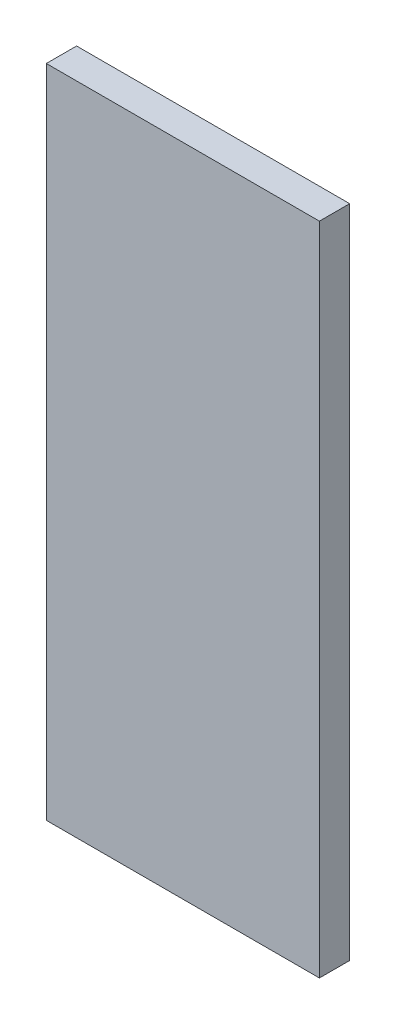
ISO-10303-21;
HEADER;
FILE_DESCRIPTION(('STEP AP214'),'2;1');
FILE_NAME('part.step','',(''),(''),'','','');
FILE_SCHEMA(('AUTOMOTIVE_DESIGN { 1 0 10303 214 1 1 1 1 }'));
ENDSEC;
DATA;
#1=APPLICATION_CONTEXT('core data for automotive mechanical design processes');
#2=APPLICATION_PROTOCOL_DEFINITION('international standard','automotive_design',2000,#1);
#3=PRODUCT_CONTEXT('',#1,'mechanical');
#4=PRODUCT('Part','Part','',(#3));
#5=PRODUCT_RELATED_PRODUCT_CATEGORY('part','',(#4));
#6=PRODUCT_DEFINITION_FORMATION('','',#4);
#7=PRODUCT_DEFINITION_CONTEXT('part definition',#1,'design');
#8=PRODUCT_DEFINITION('design','',#6,#7);
#9=PRODUCT_DEFINITION_SHAPE('','',#8);
#10=(LENGTH_UNIT() NAMED_UNIT(*) SI_UNIT(.MILLI.,.METRE.));
#11=(NAMED_UNIT(*) PLANE_ANGLE_UNIT() SI_UNIT($,.RADIAN.));
#12=(NAMED_UNIT(*) SI_UNIT($,.STERADIAN.) SOLID_ANGLE_UNIT());
#13=UNCERTAINTY_MEASURE_WITH_UNIT(LENGTH_MEASURE(1.E-05),#10,'distance_accuracy_value','');
#14=(GEOMETRIC_REPRESENTATION_CONTEXT(3) GLOBAL_UNCERTAINTY_ASSIGNED_CONTEXT((#13)) GLOBAL_UNIT_ASSIGNED_CONTEXT((#10,
#11,#12)) REPRESENTATION_CONTEXT('',''));
#15=CARTESIAN_POINT('',(0.,0.,0.));
#16=DIRECTION('',(0.,0.,1.));
#17=DIRECTION('',(1.,0.,0.));
#18=AXIS2_PLACEMENT_3D('',#15,#16,#17);
#19=CARTESIAN_POINT('',(-267.500000051,825.,76.2));
#20=DIRECTION('',(0.,-1.,0.));
#21=DIRECTION('',(0.,0.,-1.));
#22=AXIS2_PLACEMENT_3D('',#19,#20,#21);
#23=PLANE('',#22);
#24=DIRECTION('',(-1.,0.,0.));
#25=VECTOR('',#24,1.);
#26=CARTESIAN_POINT('',(-267.500000051,825.,0.));
#27=LINE('',#26,#25);
#28=CARTESIAN_POINT('',(343.700000051,825.,0.));
#29=VERTEX_POINT('',#28);
#30=CARTESIAN_POINT('',(-343.700000051,825.,0.));
#31=VERTEX_POINT('',#30);
#32=EDGE_CURVE('E65',#29,#31,#27,.T.);
#33=ORIENTED_EDGE('',*,*,#32,.T.);
#34=DIRECTION('',(0.,0.,-1.));
#35=VECTOR('',#34,1.);
#36=CARTESIAN_POINT('',(-343.700000051,825.,0.));
#37=LINE('',#36,#35);
#38=CARTESIAN_POINT('',(-343.700000051,825.,76.1999999999998));
#39=VERTEX_POINT('',#38);
#40=EDGE_CURVE('E101',#39,#31,#37,.T.);
#41=ORIENTED_EDGE('',*,*,#40,.F.);
#42=DIRECTION('',(-1.,0.,0.));
#43=VECTOR('',#42,1.);
#44=CARTESIAN_POINT('',(-267.500000051,825.,76.2));
#45=LINE('',#44,#43);
#46=CARTESIAN_POINT('',(343.700000051,825.,76.2));
#47=VERTEX_POINT('',#46);
#48=EDGE_CURVE('E50',#47,#39,#45,.T.);
#49=ORIENTED_EDGE('',*,*,#48,.F.);
#50=DIRECTION('',(0.,0.,1.));
#51=VECTOR('',#50,1.);
#52=CARTESIAN_POINT('',(343.700000051,825.,76.2));
#53=LINE('',#52,#51);
#54=EDGE_CURVE('E118',#29,#47,#53,.T.);
#55=ORIENTED_EDGE('',*,*,#54,.F.);
#56=EDGE_LOOP('',(#33,#41,#49,#55));
#57=FACE_BOUND('',#56,.T.);
#58=ADVANCED_FACE('F41',(#57),#23,.F.);
#59=CARTESIAN_POINT('',(-267.500000051,-825.,76.2));
#60=DIRECTION('',(0.,1.,0.));
#61=DIRECTION('',(0.,0.,1.));
#62=AXIS2_PLACEMENT_3D('',#59,#60,#61);
#63=PLANE('',#62);
#64=DIRECTION('',(1.,0.,0.));
#65=VECTOR('',#64,1.);
#66=CARTESIAN_POINT('',(-267.500000051,-825.,0.));
#67=LINE('',#66,#65);
#68=CARTESIAN_POINT('',(-343.700000051,-825.,0.));
#69=VERTEX_POINT('',#68);
#70=CARTESIAN_POINT('',(343.700000051,-825.,0.));
#71=VERTEX_POINT('',#70);
#72=EDGE_CURVE('E44',#69,#71,#67,.T.);
#73=ORIENTED_EDGE('',*,*,#72,.T.);
#74=DIRECTION('',(0.,0.,-1.));
#75=VECTOR('',#74,1.);
#76=CARTESIAN_POINT('',(343.700000051,-825.,76.1999999999998));
#77=LINE('',#76,#75);
#78=CARTESIAN_POINT('',(343.700000051,-825.,76.1999999999998));
#79=VERTEX_POINT('',#78);
#80=EDGE_CURVE('E113',#79,#71,#77,.T.);
#81=ORIENTED_EDGE('',*,*,#80,.F.);
#82=DIRECTION('',(1.,0.,0.));
#83=VECTOR('',#82,1.);
#84=CARTESIAN_POINT('',(-267.500000051,-825.,76.2));
#85=LINE('',#84,#83);
#86=CARTESIAN_POINT('',(-343.700000051,-825.,76.2));
#87=VERTEX_POINT('',#86);
#88=EDGE_CURVE('E11',#87,#79,#85,.T.);
#89=ORIENTED_EDGE('',*,*,#88,.F.);
#90=DIRECTION('',(0.,0.,1.));
#91=VECTOR('',#90,1.);
#92=CARTESIAN_POINT('',(-343.700000051,-825.,0.));
#93=LINE('',#92,#91);
#94=EDGE_CURVE('E91',#69,#87,#93,.T.);
#95=ORIENTED_EDGE('',*,*,#94,.F.);
#96=EDGE_LOOP('',(#73,#81,#89,#95));
#97=FACE_BOUND('',#96,.T.);
#98=ADVANCED_FACE('F92',(#97),#63,.F.);
#99=CARTESIAN_POINT('',(0.,0.,76.2));
#100=DIRECTION('',(0.,0.,-1.));
#101=DIRECTION('',(-1.,0.,0.));
#102=AXIS2_PLACEMENT_3D('',#99,#100,#101);
#103=PLANE('',#102);
#104=ORIENTED_EDGE('',*,*,#88,.T.);
#105=DIRECTION('',(0.,-1.,0.));
#106=VECTOR('',#105,1.);
#107=CARTESIAN_POINT('',(343.700000051,825.,76.2));
#108=LINE('',#107,#106);
#109=EDGE_CURVE('E109',#47,#79,#108,.T.);
#110=ORIENTED_EDGE('',*,*,#109,.F.);
#111=ORIENTED_EDGE('',*,*,#48,.T.);
#112=DIRECTION('',(0.,1.,0.));
#113=VECTOR('',#112,1.);
#114=CARTESIAN_POINT('',(-343.700000051,825.,76.1999999999998));
#115=LINE('',#114,#113);
#116=EDGE_CURVE('E97',#87,#39,#115,.T.);
#117=ORIENTED_EDGE('',*,*,#116,.F.);
#118=EDGE_LOOP('',(#104,#110,#111,#117));
#119=FACE_BOUND('',#118,.T.);
#120=ADVANCED_FACE('F127',(#119),#103,.F.);
#121=CARTESIAN_POINT('',(0.,0.,0.));
#122=DIRECTION('',(0.,0.,-1.));
#123=DIRECTION('',(-1.,0.,0.));
#124=AXIS2_PLACEMENT_3D('',#121,#122,#123);
#125=PLANE('',#124);
#126=ORIENTED_EDGE('',*,*,#32,.F.);
#127=DIRECTION('',(0.,1.,0.));
#128=VECTOR('',#127,1.);
#129=CARTESIAN_POINT('',(343.700000051,825.,0.));
#130=LINE('',#129,#128);
#131=EDGE_CURVE('E85',#71,#29,#130,.T.);
#132=ORIENTED_EDGE('',*,*,#131,.F.);
#133=ORIENTED_EDGE('',*,*,#72,.F.);
#134=DIRECTION('',(0.,-1.,0.));
#135=VECTOR('',#134,1.);
#136=CARTESIAN_POINT('',(-343.700000051,825.,0.));
#137=LINE('',#136,#135);
#138=EDGE_CURVE('E84',#31,#69,#137,.T.);
#139=ORIENTED_EDGE('',*,*,#138,.F.);
#140=EDGE_LOOP('',(#126,#132,#133,#139));
#141=FACE_BOUND('',#140,.T.);
#142=ADVANCED_FACE('F82',(#141),#125,.T.);
#143=CARTESIAN_POINT('',(343.700000051,0.,0.));
#144=DIRECTION('',(1.,0.,0.));
#145=DIRECTION('',(0.,0.,-1.));
#146=AXIS2_PLACEMENT_3D('',#143,#144,#145);
#147=PLANE('',#146);
#148=ORIENTED_EDGE('',*,*,#109,.T.);
#149=ORIENTED_EDGE('',*,*,#80,.T.);
#150=ORIENTED_EDGE('',*,*,#131,.T.);
#151=ORIENTED_EDGE('',*,*,#54,.T.);
#152=EDGE_LOOP('',(#148,#149,#150,#151));
#153=FACE_BOUND('',#152,.T.);
#154=ADVANCED_FACE('F125',(#153),#147,.T.);
#155=CARTESIAN_POINT('',(-343.700000051,0.,0.));
#156=DIRECTION('',(-1.,0.,0.));
#157=DIRECTION('',(0.,0.,1.));
#158=AXIS2_PLACEMENT_3D('',#155,#156,#157);
#159=PLANE('',#158);
#160=ORIENTED_EDGE('',*,*,#138,.T.);
#161=ORIENTED_EDGE('',*,*,#94,.T.);
#162=ORIENTED_EDGE('',*,*,#116,.T.);
#163=ORIENTED_EDGE('',*,*,#40,.T.);
#164=EDGE_LOOP('',(#160,#161,#162,#163));
#165=FACE_BOUND('',#164,.T.);
#166=ADVANCED_FACE('F100',(#165),#159,.T.);
#167=CLOSED_SHELL('',(#58,#98,#120,#142,#154,#166));
#168=MANIFOLD_SOLID_BREP('B2',#167);
#169=ADVANCED_BREP_SHAPE_REPRESENTATION('',(#18,#168),#14);
#170=SHAPE_DEFINITION_REPRESENTATION(#9,#169);
ENDSEC;
END-ISO-10303-21;
